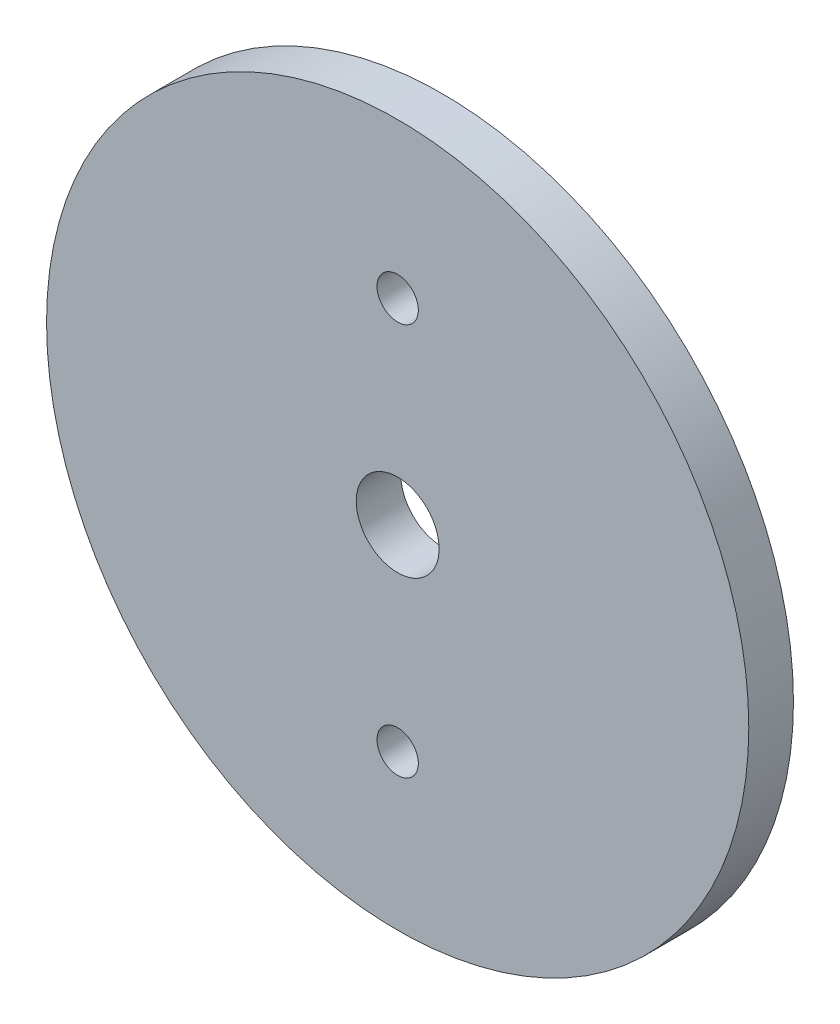
ISO-10303-21;
HEADER;
FILE_DESCRIPTION(('STEP AP214'),'2;1');
FILE_NAME('part.step','',(''),(''),'','','');
FILE_SCHEMA(('AUTOMOTIVE_DESIGN { 1 0 10303 214 1 1 1 1 }'));
ENDSEC;
DATA;
#1=APPLICATION_CONTEXT('core data for automotive mechanical design processes');
#2=APPLICATION_PROTOCOL_DEFINITION('international standard','automotive_design',2000,#1);
#3=PRODUCT_CONTEXT('',#1,'mechanical');
#4=PRODUCT('Part','Part','',(#3));
#5=PRODUCT_RELATED_PRODUCT_CATEGORY('part','',(#4));
#6=PRODUCT_DEFINITION_FORMATION('','',#4);
#7=PRODUCT_DEFINITION_CONTEXT('part definition',#1,'design');
#8=PRODUCT_DEFINITION('design','',#6,#7);
#9=PRODUCT_DEFINITION_SHAPE('','',#8);
#10=(LENGTH_UNIT() NAMED_UNIT(*) SI_UNIT(.MILLI.,.METRE.));
#11=(NAMED_UNIT(*) PLANE_ANGLE_UNIT() SI_UNIT($,.RADIAN.));
#12=(NAMED_UNIT(*) SI_UNIT($,.STERADIAN.) SOLID_ANGLE_UNIT());
#13=UNCERTAINTY_MEASURE_WITH_UNIT(LENGTH_MEASURE(1.E-05),#10,'distance_accuracy_value','');
#14=(GEOMETRIC_REPRESENTATION_CONTEXT(3) GLOBAL_UNCERTAINTY_ASSIGNED_CONTEXT((#13)) GLOBAL_UNIT_ASSIGNED_CONTEXT((#10,
#11,#12)) REPRESENTATION_CONTEXT('',''));
#15=CARTESIAN_POINT('',(0.,0.,0.));
#16=DIRECTION('',(0.,0.,1.));
#17=DIRECTION('',(1.,0.,0.));
#18=AXIS2_PLACEMENT_3D('',#15,#16,#17);
#19=CARTESIAN_POINT('',(0.,0.,3.18));
#20=DIRECTION('',(0.,0.,1.));
#21=DIRECTION('',(1.,0.,0.));
#22=AXIS2_PLACEMENT_3D('',#19,#20,#21);
#23=PLANE('',#22);
#24=CARTESIAN_POINT('',(0.,13.975,3.18));
#25=DIRECTION('',(0.,0.,1.));
#26=DIRECTION('',(1.,0.,0.));
#27=AXIS2_PLACEMENT_3D('',#24,#25,#26);
#28=CIRCLE('',#27,1.47);
#29=CARTESIAN_POINT('',(-1.47,13.975,3.18));
#30=VERTEX_POINT('',#29);
#31=EDGE_CURVE('E48',#30,#30,#28,.T.);
#32=ORIENTED_EDGE('',*,*,#31,.F.);
#33=EDGE_LOOP('',(#32));
#34=FACE_BOUND('',#33,.T.);
#35=CARTESIAN_POINT('',(0.,0.,3.18));
#36=DIRECTION('',(0.,0.,1.));
#37=DIRECTION('',(1.,0.,0.));
#38=AXIS2_PLACEMENT_3D('',#35,#36,#37);
#39=CIRCLE('',#38,25.);
#40=CARTESIAN_POINT('',(-25.,0.,3.18));
#41=VERTEX_POINT('',#40);
#42=EDGE_CURVE('E10',#41,#41,#39,.T.);
#43=ORIENTED_EDGE('',*,*,#42,.T.);
#44=EDGE_LOOP('',(#43));
#45=FACE_BOUND('',#44,.T.);
#46=CARTESIAN_POINT('',(0.,0.,3.18));
#47=DIRECTION('',(0.,0.,1.));
#48=DIRECTION('',(1.,0.,0.));
#49=AXIS2_PLACEMENT_3D('',#46,#47,#48);
#50=CIRCLE('',#49,2.95);
#51=CARTESIAN_POINT('',(-2.95,0.,3.18));
#52=VERTEX_POINT('',#51);
#53=EDGE_CURVE('E43',#52,#52,#50,.T.);
#54=ORIENTED_EDGE('',*,*,#53,.F.);
#55=EDGE_LOOP('',(#54));
#56=FACE_BOUND('',#55,.T.);
#57=CARTESIAN_POINT('',(0.,-13.975,3.18));
#58=DIRECTION('',(0.,0.,1.));
#59=DIRECTION('',(1.,0.,0.));
#60=AXIS2_PLACEMENT_3D('',#57,#58,#59);
#61=CIRCLE('',#60,1.47);
#62=CARTESIAN_POINT('',(-1.47,-13.975,3.18));
#63=VERTEX_POINT('',#62);
#64=EDGE_CURVE('E54',#63,#63,#61,.T.);
#65=ORIENTED_EDGE('',*,*,#64,.F.);
#66=EDGE_LOOP('',(#65));
#67=FACE_BOUND('',#66,.T.);
#68=ADVANCED_FACE('F32',(#34,#45,#56,#67),#23,.T.);
#69=CARTESIAN_POINT('',(0.,0.,0.));
#70=DIRECTION('',(0.,0.,1.));
#71=DIRECTION('',(1.,0.,0.));
#72=AXIS2_PLACEMENT_3D('',#69,#70,#71);
#73=PLANE('',#72);
#74=CARTESIAN_POINT('',(0.,0.,0.));
#75=DIRECTION('',(0.,0.,1.));
#76=DIRECTION('',(1.,0.,0.));
#77=AXIS2_PLACEMENT_3D('',#74,#75,#76);
#78=CIRCLE('',#77,25.);
#79=CARTESIAN_POINT('',(-25.,0.,0.));
#80=VERTEX_POINT('',#79);
#81=EDGE_CURVE('E36',#80,#80,#78,.T.);
#82=ORIENTED_EDGE('',*,*,#81,.F.);
#83=EDGE_LOOP('',(#82));
#84=FACE_BOUND('',#83,.T.);
#85=CARTESIAN_POINT('',(0.,0.,0.));
#86=DIRECTION('',(0.,0.,1.));
#87=DIRECTION('',(1.,0.,0.));
#88=AXIS2_PLACEMENT_3D('',#85,#86,#87);
#89=CIRCLE('',#88,2.95);
#90=CARTESIAN_POINT('',(-2.95,0.,0.));
#91=VERTEX_POINT('',#90);
#92=EDGE_CURVE('E45',#91,#91,#89,.T.);
#93=ORIENTED_EDGE('',*,*,#92,.T.);
#94=EDGE_LOOP('',(#93));
#95=FACE_BOUND('',#94,.T.);
#96=CARTESIAN_POINT('',(0.,13.975,0.));
#97=DIRECTION('',(0.,0.,1.));
#98=DIRECTION('',(1.,0.,0.));
#99=AXIS2_PLACEMENT_3D('',#96,#97,#98);
#100=CIRCLE('',#99,1.47);
#101=CARTESIAN_POINT('',(-1.47,13.975,0.));
#102=VERTEX_POINT('',#101);
#103=EDGE_CURVE('E51',#102,#102,#100,.T.);
#104=ORIENTED_EDGE('',*,*,#103,.T.);
#105=EDGE_LOOP('',(#104));
#106=FACE_BOUND('',#105,.T.);
#107=CARTESIAN_POINT('',(0.,-13.975,0.));
#108=DIRECTION('',(0.,0.,1.));
#109=DIRECTION('',(1.,0.,0.));
#110=AXIS2_PLACEMENT_3D('',#107,#108,#109);
#111=CIRCLE('',#110,1.47);
#112=CARTESIAN_POINT('',(-1.47,-13.975,0.));
#113=VERTEX_POINT('',#112);
#114=EDGE_CURVE('E57',#113,#113,#111,.T.);
#115=ORIENTED_EDGE('',*,*,#114,.T.);
#116=EDGE_LOOP('',(#115));
#117=FACE_BOUND('',#116,.T.);
#118=ADVANCED_FACE('F67',(#84,#95,#106,#117),#73,.F.);
#119=CARTESIAN_POINT('',(0.,0.,3.18));
#120=DIRECTION('',(0.,0.,-1.));
#121=DIRECTION('',(-1.,0.,0.));
#122=AXIS2_PLACEMENT_3D('',#119,#120,#121);
#123=CYLINDRICAL_SURFACE('',#122,25.);
#124=CARTESIAN_POINT('',(-25.,0.,3.18));
#125=CARTESIAN_POINT('',(-25.,0.,3.146875));
#126=CARTESIAN_POINT('',(-25.,0.,3.11375));
#127=CARTESIAN_POINT('',(-25.,0.,3.0475));
#128=CARTESIAN_POINT('',(-25.,0.,3.014375));
#129=CARTESIAN_POINT('',(-25.,0.,2.948125));
#130=CARTESIAN_POINT('',(-25.,0.,2.915));
#131=CARTESIAN_POINT('',(-25.,0.,2.84875));
#132=CARTESIAN_POINT('',(-25.,0.,2.815625));
#133=CARTESIAN_POINT('',(-25.,0.,2.749375));
#134=CARTESIAN_POINT('',(-25.,0.,2.71625));
#135=CARTESIAN_POINT('',(-25.,0.,2.65));
#136=CARTESIAN_POINT('',(-25.,0.,2.616875));
#137=CARTESIAN_POINT('',(-25.,0.,2.550625));
#138=CARTESIAN_POINT('',(-25.,0.,2.5175));
#139=CARTESIAN_POINT('',(-25.,0.,2.45125));
#140=CARTESIAN_POINT('',(-25.,0.,2.418125));
#141=CARTESIAN_POINT('',(-25.,0.,2.351875));
#142=CARTESIAN_POINT('',(-25.,0.,2.31875));
#143=CARTESIAN_POINT('',(-25.,0.,2.2525));
#144=CARTESIAN_POINT('',(-25.,0.,2.219375));
#145=CARTESIAN_POINT('',(-25.,0.,2.153125));
#146=CARTESIAN_POINT('',(-25.,0.,2.12));
#147=CARTESIAN_POINT('',(-25.,0.,2.05375));
#148=CARTESIAN_POINT('',(-25.,0.,2.020625));
#149=CARTESIAN_POINT('',(-25.,0.,1.954375));
#150=CARTESIAN_POINT('',(-25.,0.,1.92125));
#151=CARTESIAN_POINT('',(-25.,0.,1.855));
#152=CARTESIAN_POINT('',(-25.,0.,1.821875));
#153=CARTESIAN_POINT('',(-25.,0.,1.755625));
#154=CARTESIAN_POINT('',(-25.,0.,1.7225));
#155=CARTESIAN_POINT('',(-25.,0.,1.65625));
#156=CARTESIAN_POINT('',(-25.,0.,1.623125));
#157=CARTESIAN_POINT('',(-25.,0.,1.556875));
#158=CARTESIAN_POINT('',(-25.,0.,1.52375));
#159=CARTESIAN_POINT('',(-25.,0.,1.4575));
#160=CARTESIAN_POINT('',(-25.,0.,1.424375));
#161=CARTESIAN_POINT('',(-25.,0.,1.358125));
#162=CARTESIAN_POINT('',(-25.,0.,1.325));
#163=CARTESIAN_POINT('',(-25.,0.,1.25875));
#164=CARTESIAN_POINT('',(-25.,0.,1.225625));
#165=CARTESIAN_POINT('',(-25.,0.,1.159375));
#166=CARTESIAN_POINT('',(-25.,0.,1.12625));
#167=CARTESIAN_POINT('',(-25.,0.,1.06));
#168=CARTESIAN_POINT('',(-25.,0.,1.026875));
#169=CARTESIAN_POINT('',(-25.,0.,0.960625));
#170=CARTESIAN_POINT('',(-25.,0.,0.9275));
#171=CARTESIAN_POINT('',(-25.,0.,0.86125));
#172=CARTESIAN_POINT('',(-25.,0.,0.828125));
#173=CARTESIAN_POINT('',(-25.,0.,0.761875));
#174=CARTESIAN_POINT('',(-25.,0.,0.72875));
#175=CARTESIAN_POINT('',(-25.,0.,0.6625));
#176=CARTESIAN_POINT('',(-25.,0.,0.629375));
#177=CARTESIAN_POINT('',(-25.,0.,0.563125));
#178=CARTESIAN_POINT('',(-25.,0.,0.53));
#179=CARTESIAN_POINT('',(-25.,0.,0.46375));
#180=CARTESIAN_POINT('',(-25.,0.,0.430625));
#181=CARTESIAN_POINT('',(-25.,0.,0.364375));
#182=CARTESIAN_POINT('',(-25.,0.,0.33125));
#183=CARTESIAN_POINT('',(-25.,0.,0.265));
#184=CARTESIAN_POINT('',(-25.,0.,0.231875));
#185=CARTESIAN_POINT('',(-25.,0.,0.165625));
#186=CARTESIAN_POINT('',(-25.,0.,0.1325));
#187=CARTESIAN_POINT('',(-25.,0.,0.06625));
#188=CARTESIAN_POINT('',(-25.,0.,0.033125));
#189=CARTESIAN_POINT('',(-25.,0.,0.));
#190=B_SPLINE_CURVE_WITH_KNOTS('',3,(#124,#125,#126,#127,#128,#129,#130,#131,#132,#133,#134,
#135,#136,#137,#138,#139,#140,#141,#142,#143,#144,#145,#146,#147,#148,#149,#150,#151,#152,#153,
#154,#155,#156,#157,#158,#159,#160,#161,#162,#163,#164,#165,#166,#167,#168,#169,#170,#171,#172,
#173,#174,#175,#176,#177,#178,#179,#180,#181,#182,#183,#184,#185,#186,#187,#188,#189),
.UNSPECIFIED.,.F.,.F.,(4,2,2,2,2,2,2,2,2,2,2,2,2,2,2,2,2,2,2,2,2,2,2,2,2,2,2,2,2,2,2,2,4),(0.,
0.0993749999999996,0.19875,0.298125,0.3975,0.496875,0.59625,0.695625,0.795,0.894375,0.99375,
1.093125,1.1925,1.291875,1.39125,1.490625,1.59,1.689375,1.78875,1.888125,1.9875,2.086875,
2.18625,2.285625,2.385,2.484375,2.58375,2.683125,2.7825,2.881875,2.98125,3.080625,3.18),.UNSPECIFIED.);
#191=EDGE_CURVE('BSEAM34',#41,#80,#190,.T.);
#192=ORIENTED_EDGE('',*,*,#42,.F.);
#193=ORIENTED_EDGE('',*,*,#81,.T.);
#194=ORIENTED_EDGE('',*,*,#191,.T.);
#195=ORIENTED_EDGE('',*,*,#191,.F.);
#196=EDGE_LOOP('',(#192,#194,#193,#195));
#197=FACE_BOUND('',#196,.T.);
#198=ADVANCED_FACE('F34',(#197),#123,.T.);
#199=CARTESIAN_POINT('',(0.,0.,3.18));
#200=DIRECTION('',(0.,0.,-1.));
#201=DIRECTION('',(-1.,0.,0.));
#202=AXIS2_PLACEMENT_3D('',#199,#200,#201);
#203=CYLINDRICAL_SURFACE('',#202,2.95);
#204=CARTESIAN_POINT('',(-2.95,0.,3.18));
#205=CARTESIAN_POINT('',(-2.95,0.,3.146875));
#206=CARTESIAN_POINT('',(-2.95,0.,3.11375));
#207=CARTESIAN_POINT('',(-2.95,0.,3.0475));
#208=CARTESIAN_POINT('',(-2.95,0.,3.014375));
#209=CARTESIAN_POINT('',(-2.95,0.,2.948125));
#210=CARTESIAN_POINT('',(-2.95,0.,2.915));
#211=CARTESIAN_POINT('',(-2.95,0.,2.84875));
#212=CARTESIAN_POINT('',(-2.95,0.,2.815625));
#213=CARTESIAN_POINT('',(-2.95,0.,2.749375));
#214=CARTESIAN_POINT('',(-2.95,0.,2.71625));
#215=CARTESIAN_POINT('',(-2.95,0.,2.65));
#216=CARTESIAN_POINT('',(-2.95,0.,2.616875));
#217=CARTESIAN_POINT('',(-2.95,0.,2.550625));
#218=CARTESIAN_POINT('',(-2.95,0.,2.5175));
#219=CARTESIAN_POINT('',(-2.95,0.,2.45125));
#220=CARTESIAN_POINT('',(-2.95,0.,2.418125));
#221=CARTESIAN_POINT('',(-2.95,0.,2.351875));
#222=CARTESIAN_POINT('',(-2.95,0.,2.31875));
#223=CARTESIAN_POINT('',(-2.95,0.,2.2525));
#224=CARTESIAN_POINT('',(-2.95,0.,2.219375));
#225=CARTESIAN_POINT('',(-2.95,0.,2.153125));
#226=CARTESIAN_POINT('',(-2.95,0.,2.12));
#227=CARTESIAN_POINT('',(-2.95,0.,2.05375));
#228=CARTESIAN_POINT('',(-2.95,0.,2.020625));
#229=CARTESIAN_POINT('',(-2.95,0.,1.954375));
#230=CARTESIAN_POINT('',(-2.95,0.,1.92125));
#231=CARTESIAN_POINT('',(-2.95,0.,1.855));
#232=CARTESIAN_POINT('',(-2.95,0.,1.821875));
#233=CARTESIAN_POINT('',(-2.95,0.,1.755625));
#234=CARTESIAN_POINT('',(-2.95,0.,1.7225));
#235=CARTESIAN_POINT('',(-2.95,0.,1.65625));
#236=CARTESIAN_POINT('',(-2.95,0.,1.623125));
#237=CARTESIAN_POINT('',(-2.95,0.,1.556875));
#238=CARTESIAN_POINT('',(-2.95,0.,1.52375));
#239=CARTESIAN_POINT('',(-2.95,0.,1.4575));
#240=CARTESIAN_POINT('',(-2.95,0.,1.424375));
#241=CARTESIAN_POINT('',(-2.95,0.,1.358125));
#242=CARTESIAN_POINT('',(-2.95,0.,1.325));
#243=CARTESIAN_POINT('',(-2.95,0.,1.25875));
#244=CARTESIAN_POINT('',(-2.95,0.,1.225625));
#245=CARTESIAN_POINT('',(-2.95,0.,1.159375));
#246=CARTESIAN_POINT('',(-2.95,0.,1.12625));
#247=CARTESIAN_POINT('',(-2.95,0.,1.06));
#248=CARTESIAN_POINT('',(-2.95,0.,1.026875));
#249=CARTESIAN_POINT('',(-2.95,0.,0.960625));
#250=CARTESIAN_POINT('',(-2.95,0.,0.9275));
#251=CARTESIAN_POINT('',(-2.95,0.,0.86125));
#252=CARTESIAN_POINT('',(-2.95,0.,0.828125));
#253=CARTESIAN_POINT('',(-2.95,0.,0.761875));
#254=CARTESIAN_POINT('',(-2.95,0.,0.72875));
#255=CARTESIAN_POINT('',(-2.95,0.,0.6625));
#256=CARTESIAN_POINT('',(-2.95,0.,0.629375));
#257=CARTESIAN_POINT('',(-2.95,0.,0.563125));
#258=CARTESIAN_POINT('',(-2.95,0.,0.53));
#259=CARTESIAN_POINT('',(-2.95,0.,0.46375));
#260=CARTESIAN_POINT('',(-2.95,0.,0.430625));
#261=CARTESIAN_POINT('',(-2.95,0.,0.364375));
#262=CARTESIAN_POINT('',(-2.95,0.,0.33125));
#263=CARTESIAN_POINT('',(-2.95,0.,0.265));
#264=CARTESIAN_POINT('',(-2.95,0.,0.231875));
#265=CARTESIAN_POINT('',(-2.95,0.,0.165625));
#266=CARTESIAN_POINT('',(-2.95,0.,0.1325));
#267=CARTESIAN_POINT('',(-2.95,0.,0.06625));
#268=CARTESIAN_POINT('',(-2.95,0.,0.033125));
#269=CARTESIAN_POINT('',(-2.95,0.,0.));
#270=B_SPLINE_CURVE_WITH_KNOTS('',3,(#204,#205,#206,#207,#208,#209,#210,#211,#212,#213,#214,
#215,#216,#217,#218,#219,#220,#221,#222,#223,#224,#225,#226,#227,#228,#229,#230,#231,#232,#233,
#234,#235,#236,#237,#238,#239,#240,#241,#242,#243,#244,#245,#246,#247,#248,#249,#250,#251,#252,
#253,#254,#255,#256,#257,#258,#259,#260,#261,#262,#263,#264,#265,#266,#267,#268,#269),
.UNSPECIFIED.,.F.,.F.,(4,2,2,2,2,2,2,2,2,2,2,2,2,2,2,2,2,2,2,2,2,2,2,2,2,2,2,2,2,2,2,2,4),(0.,
0.0993750000000001,0.19875,0.298125,0.3975,0.496875,0.59625,0.695625,0.795,0.894375,0.99375,
1.093125,1.1925,1.291875,1.39125,1.490625,1.59,1.689375,1.78875,1.888125,1.9875,2.086875,
2.18625,2.285625,2.385,2.484375,2.58375,2.683125,2.7825,2.881875,2.98125,3.080625,3.18),.UNSPECIFIED.);
#271=EDGE_CURVE('BSEAM76',#52,#91,#270,.T.);
#272=ORIENTED_EDGE('',*,*,#53,.T.);
#273=ORIENTED_EDGE('',*,*,#92,.F.);
#274=ORIENTED_EDGE('',*,*,#271,.T.);
#275=ORIENTED_EDGE('',*,*,#271,.F.);
#276=EDGE_LOOP('',(#272,#274,#273,#275));
#277=FACE_BOUND('',#276,.T.);
#278=ADVANCED_FACE('F76',(#277),#203,.F.);
#279=CARTESIAN_POINT('',(0.,13.975,3.18));
#280=DIRECTION('',(0.,0.,-1.));
#281=DIRECTION('',(-1.,0.,0.));
#282=AXIS2_PLACEMENT_3D('',#279,#280,#281);
#283=CYLINDRICAL_SURFACE('',#282,1.47);
#284=CARTESIAN_POINT('',(-1.47,13.975,3.18));
#285=CARTESIAN_POINT('',(-1.47,13.975,3.146875));
#286=CARTESIAN_POINT('',(-1.47,13.975,3.11375));
#287=CARTESIAN_POINT('',(-1.47,13.975,3.0475));
#288=CARTESIAN_POINT('',(-1.47,13.975,3.014375));
#289=CARTESIAN_POINT('',(-1.47,13.975,2.948125));
#290=CARTESIAN_POINT('',(-1.47,13.975,2.915));
#291=CARTESIAN_POINT('',(-1.47,13.975,2.84875));
#292=CARTESIAN_POINT('',(-1.47,13.975,2.815625));
#293=CARTESIAN_POINT('',(-1.47,13.975,2.749375));
#294=CARTESIAN_POINT('',(-1.47,13.975,2.71625));
#295=CARTESIAN_POINT('',(-1.47,13.975,2.65));
#296=CARTESIAN_POINT('',(-1.47,13.975,2.616875));
#297=CARTESIAN_POINT('',(-1.47,13.975,2.550625));
#298=CARTESIAN_POINT('',(-1.47,13.975,2.5175));
#299=CARTESIAN_POINT('',(-1.47,13.975,2.45125));
#300=CARTESIAN_POINT('',(-1.47,13.975,2.418125));
#301=CARTESIAN_POINT('',(-1.47,13.975,2.351875));
#302=CARTESIAN_POINT('',(-1.47,13.975,2.31875));
#303=CARTESIAN_POINT('',(-1.47,13.975,2.2525));
#304=CARTESIAN_POINT('',(-1.47,13.975,2.219375));
#305=CARTESIAN_POINT('',(-1.47,13.975,2.153125));
#306=CARTESIAN_POINT('',(-1.47,13.975,2.12));
#307=CARTESIAN_POINT('',(-1.47,13.975,2.05375));
#308=CARTESIAN_POINT('',(-1.47,13.975,2.020625));
#309=CARTESIAN_POINT('',(-1.47,13.975,1.954375));
#310=CARTESIAN_POINT('',(-1.47,13.975,1.92125));
#311=CARTESIAN_POINT('',(-1.47,13.975,1.855));
#312=CARTESIAN_POINT('',(-1.47,13.975,1.821875));
#313=CARTESIAN_POINT('',(-1.47,13.975,1.755625));
#314=CARTESIAN_POINT('',(-1.47,13.975,1.7225));
#315=CARTESIAN_POINT('',(-1.47,13.975,1.65625));
#316=CARTESIAN_POINT('',(-1.47,13.975,1.623125));
#317=CARTESIAN_POINT('',(-1.47,13.975,1.556875));
#318=CARTESIAN_POINT('',(-1.47,13.975,1.52375));
#319=CARTESIAN_POINT('',(-1.47,13.975,1.4575));
#320=CARTESIAN_POINT('',(-1.47,13.975,1.424375));
#321=CARTESIAN_POINT('',(-1.47,13.975,1.358125));
#322=CARTESIAN_POINT('',(-1.47,13.975,1.325));
#323=CARTESIAN_POINT('',(-1.47,13.975,1.25875));
#324=CARTESIAN_POINT('',(-1.47,13.975,1.225625));
#325=CARTESIAN_POINT('',(-1.47,13.975,1.159375));
#326=CARTESIAN_POINT('',(-1.47,13.975,1.12625));
#327=CARTESIAN_POINT('',(-1.47,13.975,1.06));
#328=CARTESIAN_POINT('',(-1.47,13.975,1.026875));
#329=CARTESIAN_POINT('',(-1.47,13.975,0.960625));
#330=CARTESIAN_POINT('',(-1.47,13.975,0.9275));
#331=CARTESIAN_POINT('',(-1.47,13.975,0.86125));
#332=CARTESIAN_POINT('',(-1.47,13.975,0.828125));
#333=CARTESIAN_POINT('',(-1.47,13.975,0.761875));
#334=CARTESIAN_POINT('',(-1.47,13.975,0.72875));
#335=CARTESIAN_POINT('',(-1.47,13.975,0.6625));
#336=CARTESIAN_POINT('',(-1.47,13.975,0.629375));
#337=CARTESIAN_POINT('',(-1.47,13.975,0.563125));
#338=CARTESIAN_POINT('',(-1.47,13.975,0.53));
#339=CARTESIAN_POINT('',(-1.47,13.975,0.46375));
#340=CARTESIAN_POINT('',(-1.47,13.975,0.430625));
#341=CARTESIAN_POINT('',(-1.47,13.975,0.364375));
#342=CARTESIAN_POINT('',(-1.47,13.975,0.33125));
#343=CARTESIAN_POINT('',(-1.47,13.975,0.265));
#344=CARTESIAN_POINT('',(-1.47,13.975,0.231875));
#345=CARTESIAN_POINT('',(-1.47,13.975,0.165625));
#346=CARTESIAN_POINT('',(-1.47,13.975,0.1325));
#347=CARTESIAN_POINT('',(-1.47,13.975,0.06625));
#348=CARTESIAN_POINT('',(-1.47,13.975,0.033125));
#349=CARTESIAN_POINT('',(-1.47,13.975,0.));
#350=B_SPLINE_CURVE_WITH_KNOTS('',3,(#284,#285,#286,#287,#288,#289,#290,#291,#292,#293,#294,
#295,#296,#297,#298,#299,#300,#301,#302,#303,#304,#305,#306,#307,#308,#309,#310,#311,#312,#313,
#314,#315,#316,#317,#318,#319,#320,#321,#322,#323,#324,#325,#326,#327,#328,#329,#330,#331,#332,
#333,#334,#335,#336,#337,#338,#339,#340,#341,#342,#343,#344,#345,#346,#347,#348,#349),
.UNSPECIFIED.,.F.,.F.,(4,2,2,2,2,2,2,2,2,2,2,2,2,2,2,2,2,2,2,2,2,2,2,2,2,2,2,2,2,2,2,2,4),(0.,
0.0993750000000001,0.19875,0.298125,0.3975,0.496875,0.59625,0.695625,0.795,0.894375,0.99375,
1.093125,1.1925,1.291875,1.39125,1.490625,1.59,1.689375,1.78875,1.888125,1.9875,2.086875,
2.18625,2.285625,2.385,2.484375,2.58375,2.683125,2.7825,2.881875,2.98125,3.080625,3.18),.UNSPECIFIED.);
#351=EDGE_CURVE('BSEAM79',#30,#102,#350,.T.);
#352=ORIENTED_EDGE('',*,*,#31,.T.);
#353=ORIENTED_EDGE('',*,*,#103,.F.);
#354=ORIENTED_EDGE('',*,*,#351,.T.);
#355=ORIENTED_EDGE('',*,*,#351,.F.);
#356=EDGE_LOOP('',(#352,#354,#353,#355));
#357=FACE_BOUND('',#356,.T.);
#358=ADVANCED_FACE('F79',(#357),#283,.F.);
#359=CARTESIAN_POINT('',(0.,-13.975,3.18));
#360=DIRECTION('',(0.,0.,-1.));
#361=DIRECTION('',(-1.,0.,0.));
#362=AXIS2_PLACEMENT_3D('',#359,#360,#361);
#363=CYLINDRICAL_SURFACE('',#362,1.47);
#364=CARTESIAN_POINT('',(-1.47,-13.975,3.18));
#365=CARTESIAN_POINT('',(-1.47,-13.975,3.146875));
#366=CARTESIAN_POINT('',(-1.47,-13.975,3.11375));
#367=CARTESIAN_POINT('',(-1.47,-13.975,3.0475));
#368=CARTESIAN_POINT('',(-1.47,-13.975,3.014375));
#369=CARTESIAN_POINT('',(-1.47,-13.975,2.948125));
#370=CARTESIAN_POINT('',(-1.47,-13.975,2.915));
#371=CARTESIAN_POINT('',(-1.47,-13.975,2.84875));
#372=CARTESIAN_POINT('',(-1.47,-13.975,2.815625));
#373=CARTESIAN_POINT('',(-1.47,-13.975,2.749375));
#374=CARTESIAN_POINT('',(-1.47,-13.975,2.71625));
#375=CARTESIAN_POINT('',(-1.47,-13.975,2.65));
#376=CARTESIAN_POINT('',(-1.47,-13.975,2.616875));
#377=CARTESIAN_POINT('',(-1.47,-13.975,2.550625));
#378=CARTESIAN_POINT('',(-1.47,-13.975,2.5175));
#379=CARTESIAN_POINT('',(-1.47,-13.975,2.45125));
#380=CARTESIAN_POINT('',(-1.47,-13.975,2.418125));
#381=CARTESIAN_POINT('',(-1.47,-13.975,2.351875));
#382=CARTESIAN_POINT('',(-1.47,-13.975,2.31875));
#383=CARTESIAN_POINT('',(-1.47,-13.975,2.2525));
#384=CARTESIAN_POINT('',(-1.47,-13.975,2.219375));
#385=CARTESIAN_POINT('',(-1.47,-13.975,2.153125));
#386=CARTESIAN_POINT('',(-1.47,-13.975,2.12));
#387=CARTESIAN_POINT('',(-1.47,-13.975,2.05375));
#388=CARTESIAN_POINT('',(-1.47,-13.975,2.020625));
#389=CARTESIAN_POINT('',(-1.47,-13.975,1.954375));
#390=CARTESIAN_POINT('',(-1.47,-13.975,1.92125));
#391=CARTESIAN_POINT('',(-1.47,-13.975,1.855));
#392=CARTESIAN_POINT('',(-1.47,-13.975,1.821875));
#393=CARTESIAN_POINT('',(-1.47,-13.975,1.755625));
#394=CARTESIAN_POINT('',(-1.47,-13.975,1.7225));
#395=CARTESIAN_POINT('',(-1.47,-13.975,1.65625));
#396=CARTESIAN_POINT('',(-1.47,-13.975,1.623125));
#397=CARTESIAN_POINT('',(-1.47,-13.975,1.556875));
#398=CARTESIAN_POINT('',(-1.47,-13.975,1.52375));
#399=CARTESIAN_POINT('',(-1.47,-13.975,1.4575));
#400=CARTESIAN_POINT('',(-1.47,-13.975,1.424375));
#401=CARTESIAN_POINT('',(-1.47,-13.975,1.358125));
#402=CARTESIAN_POINT('',(-1.47,-13.975,1.325));
#403=CARTESIAN_POINT('',(-1.47,-13.975,1.25875));
#404=CARTESIAN_POINT('',(-1.47,-13.975,1.225625));
#405=CARTESIAN_POINT('',(-1.47,-13.975,1.159375));
#406=CARTESIAN_POINT('',(-1.47,-13.975,1.12625));
#407=CARTESIAN_POINT('',(-1.47,-13.975,1.06));
#408=CARTESIAN_POINT('',(-1.47,-13.975,1.026875));
#409=CARTESIAN_POINT('',(-1.47,-13.975,0.960625));
#410=CARTESIAN_POINT('',(-1.47,-13.975,0.9275));
#411=CARTESIAN_POINT('',(-1.47,-13.975,0.86125));
#412=CARTESIAN_POINT('',(-1.47,-13.975,0.828125));
#413=CARTESIAN_POINT('',(-1.47,-13.975,0.761875));
#414=CARTESIAN_POINT('',(-1.47,-13.975,0.72875));
#415=CARTESIAN_POINT('',(-1.47,-13.975,0.6625));
#416=CARTESIAN_POINT('',(-1.47,-13.975,0.629375));
#417=CARTESIAN_POINT('',(-1.47,-13.975,0.563125));
#418=CARTESIAN_POINT('',(-1.47,-13.975,0.53));
#419=CARTESIAN_POINT('',(-1.47,-13.975,0.46375));
#420=CARTESIAN_POINT('',(-1.47,-13.975,0.430625));
#421=CARTESIAN_POINT('',(-1.47,-13.975,0.364375));
#422=CARTESIAN_POINT('',(-1.47,-13.975,0.33125));
#423=CARTESIAN_POINT('',(-1.47,-13.975,0.265));
#424=CARTESIAN_POINT('',(-1.47,-13.975,0.231875));
#425=CARTESIAN_POINT('',(-1.47,-13.975,0.165625));
#426=CARTESIAN_POINT('',(-1.47,-13.975,0.1325));
#427=CARTESIAN_POINT('',(-1.47,-13.975,0.06625));
#428=CARTESIAN_POINT('',(-1.47,-13.975,0.033125));
#429=CARTESIAN_POINT('',(-1.47,-13.975,0.));
#430=B_SPLINE_CURVE_WITH_KNOTS('',3,(#364,#365,#366,#367,#368,#369,#370,#371,#372,#373,#374,
#375,#376,#377,#378,#379,#380,#381,#382,#383,#384,#385,#386,#387,#388,#389,#390,#391,#392,#393,
#394,#395,#396,#397,#398,#399,#400,#401,#402,#403,#404,#405,#406,#407,#408,#409,#410,#411,#412,
#413,#414,#415,#416,#417,#418,#419,#420,#421,#422,#423,#424,#425,#426,#427,#428,#429),
.UNSPECIFIED.,.F.,.F.,(4,2,2,2,2,2,2,2,2,2,2,2,2,2,2,2,2,2,2,2,2,2,2,2,2,2,2,2,2,2,2,2,4),(0.,
0.0993750000000001,0.19875,0.298125,0.3975,0.496875,0.59625,0.695625,0.795,0.894375,0.99375,
1.093125,1.1925,1.291875,1.39125,1.490625,1.59,1.689375,1.78875,1.888125,1.9875,2.086875,
2.18625,2.285625,2.385,2.484375,2.58375,2.683125,2.7825,2.881875,2.98125,3.080625,3.18),.UNSPECIFIED.);
#431=EDGE_CURVE('BSEAM63',#63,#113,#430,.T.);
#432=ORIENTED_EDGE('',*,*,#64,.T.);
#433=ORIENTED_EDGE('',*,*,#114,.F.);
#434=ORIENTED_EDGE('',*,*,#431,.T.);
#435=ORIENTED_EDGE('',*,*,#431,.F.);
#436=EDGE_LOOP('',(#432,#434,#433,#435));
#437=FACE_BOUND('',#436,.T.);
#438=ADVANCED_FACE('F63',(#437),#363,.F.);
#439=CLOSED_SHELL('',(#68,#118,#198,#278,#358,#438));
#440=MANIFOLD_SOLID_BREP('B2',#439);
#441=ADVANCED_BREP_SHAPE_REPRESENTATION('',(#18,#440),#14);
#442=SHAPE_DEFINITION_REPRESENTATION(#9,#441);
ENDSEC;
END-ISO-10303-21;
